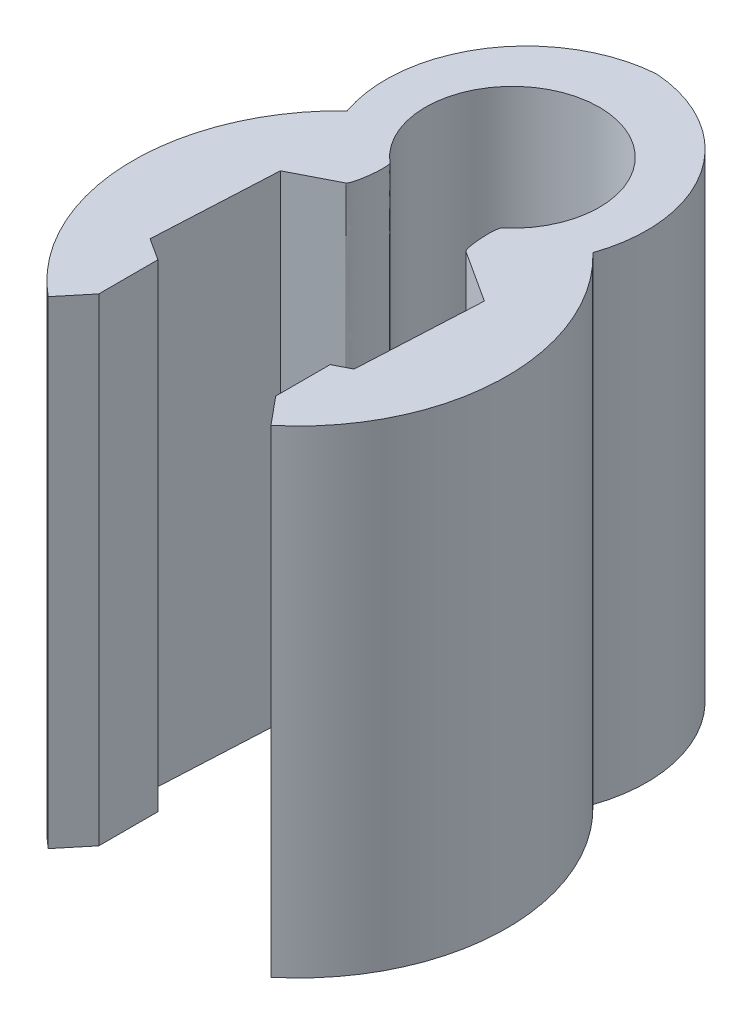
ISO-10303-21;
HEADER;
FILE_DESCRIPTION(('STEP AP214'),'2;1');
FILE_NAME('part.step','',(''),(''),'','','');
FILE_SCHEMA(('AUTOMOTIVE_DESIGN { 1 0 10303 214 1 1 1 1 }'));
ENDSEC;
DATA;
#1=APPLICATION_CONTEXT('core data for automotive mechanical design processes');
#2=APPLICATION_PROTOCOL_DEFINITION('international standard','automotive_design',2000,#1);
#3=PRODUCT_CONTEXT('',#1,'mechanical');
#4=PRODUCT('Part','Part','',(#3));
#5=PRODUCT_RELATED_PRODUCT_CATEGORY('part','',(#4));
#6=PRODUCT_DEFINITION_FORMATION('','',#4);
#7=PRODUCT_DEFINITION_CONTEXT('part definition',#1,'design');
#8=PRODUCT_DEFINITION('design','',#6,#7);
#9=PRODUCT_DEFINITION_SHAPE('','',#8);
#10=(LENGTH_UNIT() NAMED_UNIT(*) SI_UNIT(.MILLI.,.METRE.));
#11=(NAMED_UNIT(*) PLANE_ANGLE_UNIT() SI_UNIT($,.RADIAN.));
#12=(NAMED_UNIT(*) SI_UNIT($,.STERADIAN.) SOLID_ANGLE_UNIT());
#13=UNCERTAINTY_MEASURE_WITH_UNIT(LENGTH_MEASURE(1.E-05),#10,'distance_accuracy_value','');
#14=(GEOMETRIC_REPRESENTATION_CONTEXT(3) GLOBAL_UNCERTAINTY_ASSIGNED_CONTEXT((#13)) GLOBAL_UNIT_ASSIGNED_CONTEXT((#10,
#11,#12)) REPRESENTATION_CONTEXT('',''));
#15=CARTESIAN_POINT('',(0.,0.,0.));
#16=DIRECTION('',(0.,0.,1.));
#17=DIRECTION('',(1.,0.,0.));
#18=AXIS2_PLACEMENT_3D('',#15,#16,#17);
#19=CARTESIAN_POINT('',(-0.598376770378096,25.4,0.494644047014797));
#20=DIRECTION('',(0.770751226655631,0.,-0.637136207265636));
#21=DIRECTION('',(-0.637136207265636,0.,-0.770751226655631));
#22=AXIS2_PLACEMENT_3D('',#19,#20,#21);
#23=PLANE('',#22);
#24=DIRECTION('',(0.637136207265636,0.,0.770751226655631));
#25=VECTOR('',#24,1.);
#26=CARTESIAN_POINT('',(-0.598376770378096,0.,0.494644047014797));
#27=LINE('',#26,#25);
#28=CARTESIAN_POINT('',(4.70120496832042,0.,6.90561093177807));
#29=VERTEX_POINT('',#28);
#30=CARTESIAN_POINT('',(5.9187802535043,0.,8.37852619526394));
#31=VERTEX_POINT('',#30);
#32=EDGE_CURVE('E196',#29,#31,#27,.T.);
#33=ORIENTED_EDGE('',*,*,#32,.T.);
#34=DIRECTION('',(0.,-1.,0.));
#35=VECTOR('',#34,1.);
#36=CARTESIAN_POINT('',(5.9187802535043,25.4,8.37852619526394));
#37=LINE('',#36,#35);
#38=CARTESIAN_POINT('',(5.9187802535043,25.4,8.37852619526394));
#39=VERTEX_POINT('',#38);
#40=EDGE_CURVE('E177',#39,#31,#37,.T.);
#41=ORIENTED_EDGE('',*,*,#40,.F.);
#42=DIRECTION('',(0.637136207265636,0.,0.770751226655631));
#43=VECTOR('',#42,1.);
#44=CARTESIAN_POINT('',(-0.598376770378096,25.4,0.494644047014797));
#45=LINE('',#44,#43);
#46=CARTESIAN_POINT('',(4.70120496832042,25.4,6.90561093177807));
#47=VERTEX_POINT('',#46);
#48=EDGE_CURVE('E183',#47,#39,#45,.T.);
#49=ORIENTED_EDGE('',*,*,#48,.F.);
#50=DIRECTION('',(0.,-1.,0.));
#51=VECTOR('',#50,1.);
#52=CARTESIAN_POINT('',(4.70120496832042,25.4,6.90561093177807));
#53=LINE('',#52,#51);
#54=EDGE_CURVE('E225',#47,#29,#53,.T.);
#55=ORIENTED_EDGE('',*,*,#54,.T.);
#56=EDGE_LOOP('',(#33,#41,#49,#55));
#57=FACE_BOUND('',#56,.T.);
#58=ADVANCED_FACE('F46',(#57),#23,.F.);
#59=CARTESIAN_POINT('',(-1.12456517035275,25.4,-0.141892301269298));
#60=DIRECTION('',(0.,-1.,0.));
#61=DIRECTION('',(0.,0.,-1.));
#62=AXIS2_PLACEMENT_3D('',#59,#60,#61);
#63=CYLINDRICAL_SURFACE('',#62,11.0546933976404);
#64=CARTESIAN_POINT('',(-1.12456517035275,0.,-0.141892301269298));
#65=DIRECTION('',(0.,1.,0.));
#66=DIRECTION('',(0.,0.,1.));
#67=AXIS2_PLACEMENT_3D('',#64,#65,#66);
#68=CIRCLE('',#67,11.0546933976404);
#69=CARTESIAN_POINT('',(6.52662469768185,0.,-8.12096115165017));
#70=VERTEX_POINT('',#69);
#71=EDGE_CURVE('E261',#31,#70,#68,.T.);
#72=ORIENTED_EDGE('',*,*,#71,.T.);
#73=DIRECTION('',(0.,-1.,0.));
#74=VECTOR('',#73,1.);
#75=CARTESIAN_POINT('',(6.52662469768185,25.4,-8.12096115165017));
#76=LINE('',#75,#74);
#77=CARTESIAN_POINT('',(6.52662469768185,25.4,-8.12096115165017));
#78=VERTEX_POINT('',#77);
#79=EDGE_CURVE('E180',#78,#70,#76,.T.);
#80=ORIENTED_EDGE('',*,*,#79,.F.);
#81=CARTESIAN_POINT('',(-1.12456517035275,25.4,-0.141892301269298));
#82=DIRECTION('',(0.,1.,0.));
#83=DIRECTION('',(0.,0.,1.));
#84=AXIS2_PLACEMENT_3D('',#81,#82,#83);
#85=CIRCLE('',#84,11.0546933976404);
#86=EDGE_CURVE('E173',#39,#78,#85,.T.);
#87=ORIENTED_EDGE('',*,*,#86,.F.);
#88=ORIENTED_EDGE('',*,*,#40,.T.);
#89=EDGE_LOOP('',(#72,#80,#87,#88));
#90=FACE_BOUND('',#89,.T.);
#91=ADVANCED_FACE('F175',(#90),#63,.T.);
#92=CARTESIAN_POINT('',(-0.542547571953858,25.4,-10.5725213353697));
#93=DIRECTION('',(0.,-1.,0.));
#94=DIRECTION('',(0.,0.,-1.));
#95=AXIS2_PLACEMENT_3D('',#92,#93,#94);
#96=CYLINDRICAL_SURFACE('',#95,7.48220180910577);
#97=CARTESIAN_POINT('',(-0.542547571953858,0.,-10.5725213353697));
#98=DIRECTION('',(0.,1.,0.));
#99=DIRECTION('',(0.,0.,1.));
#100=AXIS2_PLACEMENT_3D('',#97,#98,#99);
#101=CIRCLE('',#100,7.48220180910577);
#102=CARTESIAN_POINT('',(0.,0.,-18.0350266817231));
#103=VERTEX_POINT('',#102);
#104=EDGE_CURVE('E258',#70,#103,#101,.T.);
#105=ORIENTED_EDGE('',*,*,#104,.T.);
#106=DIRECTION('',(0.,-1.,0.));
#107=VECTOR('',#106,1.);
#108=CARTESIAN_POINT('',(0.,25.4,-18.0350266817231));
#109=LINE('',#108,#107);
#110=CARTESIAN_POINT('',(0.,25.4,-18.0350266817231));
#111=VERTEX_POINT('',#110);
#112=EDGE_CURVE('E201',#111,#103,#109,.T.);
#113=ORIENTED_EDGE('',*,*,#112,.F.);
#114=CARTESIAN_POINT('',(-0.542547571953858,25.4,-10.5725213353697));
#115=DIRECTION('',(0.,1.,0.));
#116=DIRECTION('',(0.,0.,1.));
#117=AXIS2_PLACEMENT_3D('',#114,#115,#116);
#118=CIRCLE('',#117,7.48220180910577);
#119=EDGE_CURVE('E182',#78,#111,#118,.T.);
#120=ORIENTED_EDGE('',*,*,#119,.F.);
#121=ORIENTED_EDGE('',*,*,#79,.T.);
#122=EDGE_LOOP('',(#105,#113,#120,#121));
#123=FACE_BOUND('',#122,.T.);
#124=ADVANCED_FACE('F259',(#123),#96,.T.);
#125=CARTESIAN_POINT('',(0.542547571953858,25.4,-10.5725213353697));
#126=DIRECTION('',(0.,-1.,0.));
#127=DIRECTION('',(0.,0.,-1.));
#128=AXIS2_PLACEMENT_3D('',#125,#126,#127);
#129=CYLINDRICAL_SURFACE('',#128,7.48220180910577);
#130=CARTESIAN_POINT('',(0.542547571953858,0.,-10.5725213353697));
#131=DIRECTION('',(0.,1.,0.));
#132=DIRECTION('',(0.,0.,1.));
#133=AXIS2_PLACEMENT_3D('',#130,#131,#132);
#134=CIRCLE('',#133,7.48220180910577);
#135=CARTESIAN_POINT('',(-6.52662469768186,0.,-8.12096115165017));
#136=VERTEX_POINT('',#135);
#137=EDGE_CURVE('E252',#136,#103,#134,.F.);
#138=ORIENTED_EDGE('',*,*,#137,.F.);
#139=DIRECTION('',(0.,-1.,0.));
#140=VECTOR('',#139,1.);
#141=CARTESIAN_POINT('',(-6.52662469768186,25.4,-8.12096115165017));
#142=LINE('',#141,#140);
#143=CARTESIAN_POINT('',(-6.52662469768186,25.4,-8.12096115165017));
#144=VERTEX_POINT('',#143);
#145=EDGE_CURVE('E244',#144,#136,#142,.T.);
#146=ORIENTED_EDGE('',*,*,#145,.F.);
#147=CARTESIAN_POINT('',(0.542547571953858,25.4,-10.5725213353697));
#148=DIRECTION('',(0.,1.,0.));
#149=DIRECTION('',(0.,0.,1.));
#150=AXIS2_PLACEMENT_3D('',#147,#148,#149);
#151=CIRCLE('',#150,7.48220180910577);
#152=EDGE_CURVE('E255',#144,#111,#151,.F.);
#153=ORIENTED_EDGE('',*,*,#152,.T.);
#154=ORIENTED_EDGE('',*,*,#112,.T.);
#155=EDGE_LOOP('',(#138,#146,#153,#154));
#156=FACE_BOUND('',#155,.T.);
#157=ADVANCED_FACE('F250',(#156),#129,.T.);
#158=CARTESIAN_POINT('',(1.12456517035275,25.4,-0.141892301269298));
#159=DIRECTION('',(0.,-1.,0.));
#160=DIRECTION('',(0.,0.,-1.));
#161=AXIS2_PLACEMENT_3D('',#158,#159,#160);
#162=CYLINDRICAL_SURFACE('',#161,11.0546933976404);
#163=CARTESIAN_POINT('',(1.12456517035275,0.,-0.141892301269298));
#164=DIRECTION('',(0.,1.,0.));
#165=DIRECTION('',(0.,0.,1.));
#166=AXIS2_PLACEMENT_3D('',#163,#164,#165);
#167=CIRCLE('',#166,11.0546933976404);
#168=CARTESIAN_POINT('',(-5.91878025350429,0.,8.37852619526395));
#169=VERTEX_POINT('',#168);
#170=EDGE_CURVE('E266',#169,#136,#167,.F.);
#171=ORIENTED_EDGE('',*,*,#170,.F.);
#172=DIRECTION('',(0.,-1.,0.));
#173=VECTOR('',#172,1.);
#174=CARTESIAN_POINT('',(-5.91878025350429,25.4,8.37852619526395));
#175=LINE('',#174,#173);
#176=CARTESIAN_POINT('',(-5.91878025350429,25.4,8.37852619526395));
#177=VERTEX_POINT('',#176);
#178=EDGE_CURVE('E242',#177,#169,#175,.T.);
#179=ORIENTED_EDGE('',*,*,#178,.F.);
#180=CARTESIAN_POINT('',(1.12456517035275,25.4,-0.141892301269298));
#181=DIRECTION('',(0.,1.,0.));
#182=DIRECTION('',(0.,0.,1.));
#183=AXIS2_PLACEMENT_3D('',#180,#181,#182);
#184=CIRCLE('',#183,11.0546933976404);
#185=EDGE_CURVE('E546',#177,#144,#184,.F.);
#186=ORIENTED_EDGE('',*,*,#185,.T.);
#187=ORIENTED_EDGE('',*,*,#145,.T.);
#188=EDGE_LOOP('',(#171,#179,#186,#187));
#189=FACE_BOUND('',#188,.T.);
#190=ADVANCED_FACE('F507',(#189),#162,.T.);
#191=CARTESIAN_POINT('',(0.598376770378092,25.4,0.494644047014792));
#192=DIRECTION('',(0.770751226655632,0.,0.637136207265635));
#193=DIRECTION('',(0.637136207265635,0.,-0.770751226655632));
#194=AXIS2_PLACEMENT_3D('',#191,#192,#193);
#195=PLANE('',#194);
#196=DIRECTION('',(-0.637136207265635,0.,0.770751226655632));
#197=VECTOR('',#196,1.);
#198=CARTESIAN_POINT('',(0.598376770378092,0.,0.494644047014792));
#199=LINE('',#198,#197);
#200=CARTESIAN_POINT('',(-4.70120496832041,0.,6.90561093177807));
#201=VERTEX_POINT('',#200);
#202=EDGE_CURVE('E268',#201,#169,#199,.T.);
#203=ORIENTED_EDGE('',*,*,#202,.F.);
#204=DIRECTION('',(0.,-1.,0.));
#205=VECTOR('',#204,1.);
#206=CARTESIAN_POINT('',(-4.70120496832041,25.4,6.90561093177807));
#207=LINE('',#206,#205);
#208=CARTESIAN_POINT('',(-4.70120496832041,25.4,6.90561093177807));
#209=VERTEX_POINT('',#208);
#210=EDGE_CURVE('E240',#209,#201,#207,.T.);
#211=ORIENTED_EDGE('',*,*,#210,.F.);
#212=DIRECTION('',(-0.637136207265635,0.,0.770751226655632));
#213=VECTOR('',#212,1.);
#214=CARTESIAN_POINT('',(0.598376770378092,25.4,0.494644047014792));
#215=LINE('',#214,#213);
#216=EDGE_CURVE('E543',#209,#177,#215,.T.);
#217=ORIENTED_EDGE('',*,*,#216,.T.);
#218=ORIENTED_EDGE('',*,*,#178,.T.);
#219=EDGE_LOOP('',(#203,#211,#217,#218));
#220=FACE_BOUND('',#219,.T.);
#221=ADVANCED_FACE('F510',(#220),#195,.T.);
#222=CARTESIAN_POINT('',(-4.70120496832042,25.4,0.));
#223=DIRECTION('',(1.,0.,0.));
#224=DIRECTION('',(0.,0.,-1.));
#225=AXIS2_PLACEMENT_3D('',#222,#223,#224);
#226=PLANE('',#225);
#227=DIRECTION('',(0.,0.,1.));
#228=VECTOR('',#227,1.);
#229=CARTESIAN_POINT('',(-4.70120496832042,0.,0.));
#230=LINE('',#229,#228);
#231=CARTESIAN_POINT('',(-4.70120496832042,0.,3.76579802688678));
#232=VERTEX_POINT('',#231);
#233=EDGE_CURVE('E273',#232,#201,#230,.T.);
#234=ORIENTED_EDGE('',*,*,#233,.F.);
#235=DIRECTION('',(0.,-1.,0.));
#236=VECTOR('',#235,1.);
#237=CARTESIAN_POINT('',(-4.70120496832042,25.4,3.76579802688678));
#238=LINE('',#237,#236);
#239=CARTESIAN_POINT('',(-4.70120496832042,25.4,3.76579802688678));
#240=VERTEX_POINT('',#239);
#241=EDGE_CURVE('E238',#240,#232,#238,.T.);
#242=ORIENTED_EDGE('',*,*,#241,.F.);
#243=DIRECTION('',(0.,0.,1.));
#244=VECTOR('',#243,1.);
#245=CARTESIAN_POINT('',(-4.70120496832042,25.4,0.));
#246=LINE('',#245,#244);
#247=EDGE_CURVE('E538',#240,#209,#246,.T.);
#248=ORIENTED_EDGE('',*,*,#247,.T.);
#249=ORIENTED_EDGE('',*,*,#210,.T.);
#250=EDGE_LOOP('',(#234,#242,#248,#249));
#251=FACE_BOUND('',#250,.T.);
#252=ADVANCED_FACE('F514',(#251),#226,.T.);
#253=CARTESIAN_POINT('',(-3.10319954031292,25.4,4.7991017506406));
#254=DIRECTION('',(0.542992045549067,0.,-0.839737839132214));
#255=DIRECTION('',(-0.839737839132214,0.,-0.542992045549067));
#256=AXIS2_PLACEMENT_3D('',#253,#254,#255);
#257=PLANE('',#256);
#258=DIRECTION('',(0.839737839132214,0.,0.542992045549067));
#259=VECTOR('',#258,1.);
#260=CARTESIAN_POINT('',(-3.10319954031292,0.,4.7991017506406));
#261=LINE('',#260,#259);
#262=CARTESIAN_POINT('',(-5.87396222791367,0.,3.00746866069182));
#263=VERTEX_POINT('',#262);
#264=EDGE_CURVE('E276',#263,#232,#261,.T.);
#265=ORIENTED_EDGE('',*,*,#264,.F.);
#266=DIRECTION('',(0.,-1.,0.));
#267=VECTOR('',#266,1.);
#268=CARTESIAN_POINT('',(-5.87396222791367,25.4,3.00746866069182));
#269=LINE('',#268,#267);
#270=CARTESIAN_POINT('',(-5.87396222791367,25.4,3.00746866069182));
#271=VERTEX_POINT('',#270);
#272=EDGE_CURVE('E236',#271,#263,#269,.T.);
#273=ORIENTED_EDGE('',*,*,#272,.F.);
#274=DIRECTION('',(0.839737839132214,0.,0.542992045549067));
#275=VECTOR('',#274,1.);
#276=CARTESIAN_POINT('',(-3.10319954031292,25.4,4.7991017506406));
#277=LINE('',#276,#275);
#278=EDGE_CURVE('E537',#271,#240,#277,.T.);
#279=ORIENTED_EDGE('',*,*,#278,.T.);
#280=ORIENTED_EDGE('',*,*,#241,.T.);
#281=EDGE_LOOP('',(#265,#273,#279,#280));
#282=FACE_BOUND('',#281,.T.);
#283=ADVANCED_FACE('F518',(#282),#257,.T.);
#284=CARTESIAN_POINT('',(-5.70774380155759,25.4,-0.287898759602873));
#285=DIRECTION('',(0.998730323982081,0.,0.0503759859322613));
#286=DIRECTION('',(0.0503759859322613,0.,-0.998730323982081));
#287=AXIS2_PLACEMENT_3D('',#284,#285,#286);
#288=PLANE('',#287);
#289=DIRECTION('',(-0.0503759859322613,0.,0.998730323982081));
#290=VECTOR('',#289,1.);
#291=CARTESIAN_POINT('',(-5.70774380155759,0.,-0.287898759602873));
#292=LINE('',#291,#290);
#293=CARTESIAN_POINT('',(-5.54152537520151,0.,-3.58326617989757));
#294=VERTEX_POINT('',#293);
#295=EDGE_CURVE('E279',#294,#263,#292,.T.);
#296=ORIENTED_EDGE('',*,*,#295,.F.);
#297=DIRECTION('',(0.,-1.,0.));
#298=VECTOR('',#297,1.);
#299=CARTESIAN_POINT('',(-5.54152537520151,25.4,-3.58326617989757));
#300=LINE('',#299,#298);
#301=CARTESIAN_POINT('',(-5.54152537520151,25.4,-3.58326617989757));
#302=VERTEX_POINT('',#301);
#303=EDGE_CURVE('E233',#302,#294,#300,.T.);
#304=ORIENTED_EDGE('',*,*,#303,.F.);
#305=DIRECTION('',(-0.0503759859322613,0.,0.998730323982081));
#306=VECTOR('',#305,1.);
#307=CARTESIAN_POINT('',(-5.70774380155759,25.4,-0.287898759602873));
#308=LINE('',#307,#306);
#309=EDGE_CURVE('E388',#302,#271,#308,.T.);
#310=ORIENTED_EDGE('',*,*,#309,.T.);
#311=ORIENTED_EDGE('',*,*,#272,.T.);
#312=EDGE_LOOP('',(#296,#304,#310,#311));
#313=FACE_BOUND('',#312,.T.);
#314=ADVANCED_FACE('F521',(#313),#288,.T.);
#315=CARTESIAN_POINT('',(-2.60454426124468,25.4,-5.08700051024348));
#316=DIRECTION('',(0.455738278433015,0.,0.890113825064476));
#317=DIRECTION('',(0.890113825064476,0.,-0.455738278433015));
#318=AXIS2_PLACEMENT_3D('',#315,#316,#317);
#319=PLANE('',#318);
#320=DIRECTION('',(-0.890113825064476,0.,0.455738278433015));
#321=VECTOR('',#320,1.);
#322=CARTESIAN_POINT('',(-2.60454426124468,0.,-5.08700051024348));
#323=LINE('',#322,#321);
#324=CARTESIAN_POINT('',(-3.24270927997033,0.,-4.76026002065594));
#325=VERTEX_POINT('',#324);
#326=EDGE_CURVE('E281',#325,#294,#323,.T.);
#327=ORIENTED_EDGE('',*,*,#326,.F.);
#328=CARTESIAN_POINT('',(-3.24270927997033,26.67,-4.76026002065594));
#329=CARTESIAN_POINT('',(-3.24270927997033,17.3566666666667,-4.76026002065594));
#330=CARTESIAN_POINT('',(-3.24270927997033,8.04333333333334,-4.76026002065594));
#331=CARTESIAN_POINT('',(-3.24270927997033,-1.27,-4.76026002065594));
#332=(BOUNDED_CURVE() B_SPLINE_CURVE(3,(#328,#329,#330,#331),.UNSPECIFIED.,.F.,
.F.) B_SPLINE_CURVE_WITH_KNOTS((4,4),(-0.00127,0.02667),
.UNSPECIFIED.) CURVE() GEOMETRIC_REPRESENTATION_ITEM() RATIONAL_B_SPLINE_CURVE((1.,1.,1.,1.)) REPRESENTATION_ITEM(''));
#333=CARTESIAN_POINT('',(-3.24270927997033,25.4,-4.76026002065594));
#334=VERTEX_POINT('',#333);
#335=EDGE_CURVE('E12',#325,#334,#332,.F.);
#336=ORIENTED_EDGE('',*,*,#335,.T.);
#337=DIRECTION('',(-0.890113825064476,0.,0.455738278433015));
#338=VECTOR('',#337,1.);
#339=CARTESIAN_POINT('',(-2.60454426124468,25.4,-5.08700051024348));
#340=LINE('',#339,#338);
#341=EDGE_CURVE('E319',#334,#302,#340,.T.);
#342=ORIENTED_EDGE('',*,*,#341,.T.);
#343=ORIENTED_EDGE('',*,*,#303,.T.);
#344=EDGE_LOOP('',(#327,#336,#342,#343));
#345=FACE_BOUND('',#344,.T.);
#346=ADVANCED_FACE('F371',(#345),#319,.T.);
#347=CARTESIAN_POINT('',(0.,25.4,-10.3692276538807));
#348=DIRECTION('',(0.,-1.,0.));
#349=DIRECTION('',(0.,0.,-1.));
#350=AXIS2_PLACEMENT_3D('',#347,#348,#349);
#351=CYLINDRICAL_SURFACE('',#350,4.61735997238747);
#352=CARTESIAN_POINT('',(0.,0.,-10.3692276538807));
#353=DIRECTION('',(0.,1.,0.));
#354=DIRECTION('',(0.,0.,1.));
#355=AXIS2_PLACEMENT_3D('',#352,#353,#354);
#356=CIRCLE('',#355,4.61735997238747);
#357=CARTESIAN_POINT('',(2.97420564902517,0.,-6.83735649656018));
#358=VERTEX_POINT('',#357);
#359=CARTESIAN_POINT('',(-2.99713740518316,0.,-6.85679537851113));
#360=VERTEX_POINT('',#359);
#361=EDGE_CURVE('E210',#358,#360,#356,.T.);
#362=ORIENTED_EDGE('',*,*,#361,.F.);
#363=CARTESIAN_POINT('',(2.97420564902517,26.67,-6.83735649656018));
#364=CARTESIAN_POINT('',(2.97420564902517,17.3566666666667,-6.83735649656018));
#365=CARTESIAN_POINT('',(2.97420564902517,8.04333333333334,-6.83735649656018));
#366=CARTESIAN_POINT('',(2.97420564902517,-1.27,-6.83735649656018));
#367=(BOUNDED_CURVE() B_SPLINE_CURVE(3,(#363,#364,#365,#366),.UNSPECIFIED.,.F.,
.F.) B_SPLINE_CURVE_WITH_KNOTS((4,4),(-0.00127,0.02667),
.UNSPECIFIED.) CURVE() GEOMETRIC_REPRESENTATION_ITEM() RATIONAL_B_SPLINE_CURVE((1.,1.,1.,1.)) REPRESENTATION_ITEM(''));
#368=CARTESIAN_POINT('',(2.97420564902517,25.4,-6.83735649656018));
#369=VERTEX_POINT('',#368);
#370=EDGE_CURVE('E455',#358,#369,#367,.F.);
#371=ORIENTED_EDGE('',*,*,#370,.T.);
#372=CARTESIAN_POINT('',(0.,25.4,-10.3692276538807));
#373=DIRECTION('',(0.,1.,0.));
#374=DIRECTION('',(0.,0.,1.));
#375=AXIS2_PLACEMENT_3D('',#372,#373,#374);
#376=CIRCLE('',#375,4.61735997238747);
#377=CARTESIAN_POINT('',(-2.99713740518315,25.4,-6.85679537851113));
#378=VERTEX_POINT('',#377);
#379=EDGE_CURVE('E311',#369,#378,#376,.T.);
#380=ORIENTED_EDGE('',*,*,#379,.T.);
#381=CARTESIAN_POINT('',(-2.99713740518315,-1.27,-6.85679537851113));
#382=CARTESIAN_POINT('',(-2.99713740518315,8.04333333333334,-6.85679537851113));
#383=CARTESIAN_POINT('',(-2.99713740518315,17.3566666666667,-6.85679537851113));
#384=CARTESIAN_POINT('',(-2.99713740518315,26.67,-6.85679537851113));
#385=(BOUNDED_CURVE() B_SPLINE_CURVE(3,(#381,#382,#383,#384),.UNSPECIFIED.,.F.,
.F.) B_SPLINE_CURVE_WITH_KNOTS((4,4),(-0.00127,0.02667),
.UNSPECIFIED.) CURVE() GEOMETRIC_REPRESENTATION_ITEM() RATIONAL_B_SPLINE_CURVE((1.,1.,1.,1.)) REPRESENTATION_ITEM(''));
#386=EDGE_CURVE('E476',#378,#360,#385,.F.);
#387=ORIENTED_EDGE('',*,*,#386,.T.);
#388=EDGE_LOOP('',(#362,#371,#380,#387));
#389=FACE_BOUND('',#388,.T.);
#390=ADVANCED_FACE('F367',(#389),#351,.F.);
#391=CARTESIAN_POINT('',(3.10319954031291,25.4,-4.79910175064061));
#392=DIRECTION('',(-0.542992045549066,0.,0.839737839132214));
#393=DIRECTION('',(0.839737839132214,0.,0.542992045549066));
#394=AXIS2_PLACEMENT_3D('',#391,#392,#393);
#395=PLANE('',#394);
#396=DIRECTION('',(-0.839737839132214,0.,-0.542992045549066));
#397=VECTOR('',#396,1.);
#398=CARTESIAN_POINT('',(3.10319954031291,25.4,-4.79910175064061));
#399=LINE('',#398,#397);
#400=CARTESIAN_POINT('',(5.87396222791367,25.4,-3.00746866069182));
#401=VERTEX_POINT('',#400);
#402=CARTESIAN_POINT('',(3.10265788418253,25.4,-4.79945199682044));
#403=VERTEX_POINT('',#402);
#404=EDGE_CURVE('E211',#401,#403,#399,.T.);
#405=ORIENTED_EDGE('',*,*,#404,.T.);
#406=CARTESIAN_POINT('',(3.10265788418253,-1.27,-4.79945199682044));
#407=CARTESIAN_POINT('',(3.10265788418253,8.04333333333334,-4.79945199682044));
#408=CARTESIAN_POINT('',(3.10265788418253,17.3566666666667,-4.79945199682044));
#409=CARTESIAN_POINT('',(3.10265788418253,26.67,-4.79945199682044));
#410=(BOUNDED_CURVE() B_SPLINE_CURVE(3,(#406,#407,#408,#409),.UNSPECIFIED.,.F.,
.F.) B_SPLINE_CURVE_WITH_KNOTS((4,4),(-0.00127,0.02667),
.UNSPECIFIED.) CURVE() GEOMETRIC_REPRESENTATION_ITEM() RATIONAL_B_SPLINE_CURVE((1.,1.,1.,1.)) REPRESENTATION_ITEM(''));
#411=CARTESIAN_POINT('',(3.10265788418253,0.,-4.79945199682044));
#412=VERTEX_POINT('',#411);
#413=EDGE_CURVE('E197',#403,#412,#410,.F.);
#414=ORIENTED_EDGE('',*,*,#413,.T.);
#415=DIRECTION('',(-0.839737839132214,0.,-0.542992045549066));
#416=VECTOR('',#415,1.);
#417=CARTESIAN_POINT('',(3.10319954031291,0.,-4.79910175064061));
#418=LINE('',#417,#416);
#419=CARTESIAN_POINT('',(5.87396222791367,0.,-3.00746866069182));
#420=VERTEX_POINT('',#419);
#421=EDGE_CURVE('E205',#420,#412,#418,.T.);
#422=ORIENTED_EDGE('',*,*,#421,.F.);
#423=DIRECTION('',(0.,-1.,0.));
#424=VECTOR('',#423,1.);
#425=CARTESIAN_POINT('',(5.87396222791367,25.4,-3.00746866069182));
#426=LINE('',#425,#424);
#427=EDGE_CURVE('E231',#401,#420,#426,.T.);
#428=ORIENTED_EDGE('',*,*,#427,.F.);
#429=EDGE_LOOP('',(#405,#414,#422,#428));
#430=FACE_BOUND('',#429,.T.);
#431=ADVANCED_FACE('F349',(#430),#395,.T.);
#432=CARTESIAN_POINT('',(5.70774380155759,25.4,0.287898759602873));
#433=DIRECTION('',(-0.998730323982081,0.,-0.0503759859322612));
#434=DIRECTION('',(-0.0503759859322612,0.,0.998730323982081));
#435=AXIS2_PLACEMENT_3D('',#432,#433,#434);
#436=PLANE('',#435);
#437=DIRECTION('',(0.0503759859322612,0.,-0.998730323982081));
#438=VECTOR('',#437,1.);
#439=CARTESIAN_POINT('',(5.70774380155759,0.,0.287898759602873));
#440=LINE('',#439,#438);
#441=CARTESIAN_POINT('',(5.54152537520151,0.,3.58326617989757));
#442=VERTEX_POINT('',#441);
#443=EDGE_CURVE('E209',#442,#420,#440,.T.);
#444=ORIENTED_EDGE('',*,*,#443,.F.);
#445=DIRECTION('',(0.,-1.,0.));
#446=VECTOR('',#445,1.);
#447=CARTESIAN_POINT('',(5.54152537520151,25.4,3.58326617989757));
#448=LINE('',#447,#446);
#449=CARTESIAN_POINT('',(5.54152537520151,25.4,3.58326617989757));
#450=VERTEX_POINT('',#449);
#451=EDGE_CURVE('E229',#450,#442,#448,.T.);
#452=ORIENTED_EDGE('',*,*,#451,.F.);
#453=DIRECTION('',(0.0503759859322612,0.,-0.998730323982081));
#454=VECTOR('',#453,1.);
#455=CARTESIAN_POINT('',(5.70774380155759,25.4,0.287898759602873));
#456=LINE('',#455,#454);
#457=EDGE_CURVE('E328',#450,#401,#456,.T.);
#458=ORIENTED_EDGE('',*,*,#457,.T.);
#459=ORIENTED_EDGE('',*,*,#427,.T.);
#460=EDGE_LOOP('',(#444,#452,#458,#459));
#461=FACE_BOUND('',#460,.T.);
#462=ADVANCED_FACE('F343',(#461),#436,.T.);
#463=CARTESIAN_POINT('',(2.60454426124468,25.4,5.08700051024348));
#464=DIRECTION('',(-0.455738278433015,0.,-0.890113825064475));
#465=DIRECTION('',(-0.890113825064476,0.,0.455738278433015));
#466=AXIS2_PLACEMENT_3D('',#463,#464,#465);
#467=PLANE('',#466);
#468=DIRECTION('',(0.890113825064476,0.,-0.455738278433015));
#469=VECTOR('',#468,1.);
#470=CARTESIAN_POINT('',(2.60454426124468,0.,5.08700051024348));
#471=LINE('',#470,#469);
#472=CARTESIAN_POINT('',(4.70120496832042,0.,4.01351022822069));
#473=VERTEX_POINT('',#472);
#474=EDGE_CURVE('E221',#473,#442,#471,.T.);
#475=ORIENTED_EDGE('',*,*,#474,.F.);
#476=DIRECTION('',(0.,-1.,0.));
#477=VECTOR('',#476,1.);
#478=CARTESIAN_POINT('',(4.70120496832042,25.4,4.01351022822069));
#479=LINE('',#478,#477);
#480=CARTESIAN_POINT('',(4.70120496832042,25.4,4.01351022822069));
#481=VERTEX_POINT('',#480);
#482=EDGE_CURVE('E227',#481,#473,#479,.T.);
#483=ORIENTED_EDGE('',*,*,#482,.F.);
#484=DIRECTION('',(0.890113825064476,0.,-0.455738278433015));
#485=VECTOR('',#484,1.);
#486=CARTESIAN_POINT('',(2.60454426124468,25.4,5.08700051024348));
#487=LINE('',#486,#485);
#488=EDGE_CURVE('E331',#481,#450,#487,.T.);
#489=ORIENTED_EDGE('',*,*,#488,.T.);
#490=ORIENTED_EDGE('',*,*,#451,.T.);
#491=EDGE_LOOP('',(#475,#483,#489,#490));
#492=FACE_BOUND('',#491,.T.);
#493=ADVANCED_FACE('F339',(#492),#467,.T.);
#494=CARTESIAN_POINT('',(4.70120496832042,25.4,0.));
#495=DIRECTION('',(1.,0.,0.));
#496=DIRECTION('',(0.,0.,-1.));
#497=AXIS2_PLACEMENT_3D('',#494,#495,#496);
#498=PLANE('',#497);
#499=DIRECTION('',(0.,0.,1.));
#500=VECTOR('',#499,1.);
#501=CARTESIAN_POINT('',(4.70120496832042,0.,0.));
#502=LINE('',#501,#500);
#503=EDGE_CURVE('E193',#473,#29,#502,.T.);
#504=ORIENTED_EDGE('',*,*,#503,.T.);
#505=ORIENTED_EDGE('',*,*,#54,.F.);
#506=DIRECTION('',(0.,0.,1.));
#507=VECTOR('',#506,1.);
#508=CARTESIAN_POINT('',(4.70120496832042,25.4,0.));
#509=LINE('',#508,#507);
#510=EDGE_CURVE('E189',#481,#47,#509,.T.);
#511=ORIENTED_EDGE('',*,*,#510,.F.);
#512=ORIENTED_EDGE('',*,*,#482,.T.);
#513=EDGE_LOOP('',(#504,#505,#511,#512));
#514=FACE_BOUND('',#513,.T.);
#515=ADVANCED_FACE('F305',(#514),#498,.F.);
#516=CARTESIAN_POINT('',(0.,25.4,0.));
#517=DIRECTION('',(0.,1.,0.));
#518=DIRECTION('',(0.,0.,1.));
#519=AXIS2_PLACEMENT_3D('',#516,#517,#518);
#520=PLANE('',#519);
#521=ORIENTED_EDGE('',*,*,#379,.F.);
#522=CARTESIAN_POINT('',(3.10265788418253,25.4,-4.79945199682044));
#523=CARTESIAN_POINT('',(1.66110640734555,25.4,-5.73158932432362));
#524=CARTESIAN_POINT('',(2.97420564902517,25.4,-6.83735649656018));
#525=(BOUNDED_CURVE() B_SPLINE_CURVE(2,(#522,#523,#524),.UNSPECIFIED.,.F.,
.F.) B_SPLINE_CURVE_WITH_KNOTS((3,3),(0.,1.),
.UNSPECIFIED.) CURVE() GEOMETRIC_REPRESENTATION_ITEM() RATIONAL_B_SPLINE_CURVE((1.,
0.118948345896042,1.)) REPRESENTATION_ITEM(''));
#526=EDGE_CURVE('E60',#369,#403,#525,.F.);
#527=ORIENTED_EDGE('',*,*,#526,.T.);
#528=ORIENTED_EDGE('',*,*,#404,.F.);
#529=ORIENTED_EDGE('',*,*,#457,.F.);
#530=ORIENTED_EDGE('',*,*,#488,.F.);
#531=ORIENTED_EDGE('',*,*,#510,.T.);
#532=ORIENTED_EDGE('',*,*,#48,.T.);
#533=ORIENTED_EDGE('',*,*,#86,.T.);
#534=ORIENTED_EDGE('',*,*,#119,.T.);
#535=ORIENTED_EDGE('',*,*,#152,.F.);
#536=ORIENTED_EDGE('',*,*,#185,.F.);
#537=ORIENTED_EDGE('',*,*,#216,.F.);
#538=ORIENTED_EDGE('',*,*,#247,.F.);
#539=ORIENTED_EDGE('',*,*,#278,.F.);
#540=ORIENTED_EDGE('',*,*,#309,.F.);
#541=ORIENTED_EDGE('',*,*,#341,.F.);
#542=CARTESIAN_POINT('',(-2.99713740518315,25.4,-6.85679537851113));
#543=CARTESIAN_POINT('',(-1.55363692098566,25.4,-5.6250650684561));
#544=CARTESIAN_POINT('',(-3.24270927997033,25.4,-4.76026002065594));
#545=(BOUNDED_CURVE() B_SPLINE_CURVE(2,(#542,#543,#544),.UNSPECIFIED.,.F.,
.F.) B_SPLINE_CURVE_WITH_KNOTS((3,3),(0.,1.),
.UNSPECIFIED.) CURVE() GEOMETRIC_REPRESENTATION_ITEM() RATIONAL_B_SPLINE_CURVE((1.,
0.111239360045646,1.)) REPRESENTATION_ITEM(''));
#546=EDGE_CURVE('E73',#334,#378,#545,.F.);
#547=ORIENTED_EDGE('',*,*,#546,.T.);
#548=EDGE_LOOP('',(#521,#527,#528,#529,#530,#531,#532,#533,#534,#535,#536,#537,#538,#539,#540,
#541,#547));
#549=FACE_BOUND('',#548,.T.);
#550=ADVANCED_FACE('F186',(#549),#520,.T.);
#551=CARTESIAN_POINT('',(0.,0.,0.));
#552=DIRECTION('',(0.,1.,0.));
#553=DIRECTION('',(0.,0.,1.));
#554=AXIS2_PLACEMENT_3D('',#551,#552,#553);
#555=PLANE('',#554);
#556=ORIENTED_EDGE('',*,*,#421,.T.);
#557=CARTESIAN_POINT('',(2.97420564902517,0.,-6.83735649656018));
#558=CARTESIAN_POINT('',(1.66110640734555,0.,-5.73158932432362));
#559=CARTESIAN_POINT('',(3.10265788418253,0.,-4.79945199682044));
#560=(BOUNDED_CURVE() B_SPLINE_CURVE(2,(#557,#558,#559),.UNSPECIFIED.,.F.,
.F.) B_SPLINE_CURVE_WITH_KNOTS((3,3),(0.,1.),
.UNSPECIFIED.) CURVE() GEOMETRIC_REPRESENTATION_ITEM() RATIONAL_B_SPLINE_CURVE((1.,
0.118948345896042,1.)) REPRESENTATION_ITEM(''));
#561=EDGE_CURVE('E345',#412,#358,#560,.F.);
#562=ORIENTED_EDGE('',*,*,#561,.T.);
#563=ORIENTED_EDGE('',*,*,#361,.T.);
#564=CARTESIAN_POINT('',(-3.24270927997033,0.,-4.76026002065594));
#565=CARTESIAN_POINT('',(-1.55363692098566,0.,-5.6250650684561));
#566=CARTESIAN_POINT('',(-2.99713740518315,0.,-6.85679537851113));
#567=(BOUNDED_CURVE() B_SPLINE_CURVE(2,(#564,#565,#566),.UNSPECIFIED.,.F.,
.F.) B_SPLINE_CURVE_WITH_KNOTS((3,3),(0.,1.),
.UNSPECIFIED.) CURVE() GEOMETRIC_REPRESENTATION_ITEM() RATIONAL_B_SPLINE_CURVE((1.,
0.111239360045646,1.)) REPRESENTATION_ITEM(''));
#568=EDGE_CURVE('E200',#360,#325,#567,.F.);
#569=ORIENTED_EDGE('',*,*,#568,.T.);
#570=ORIENTED_EDGE('',*,*,#326,.T.);
#571=ORIENTED_EDGE('',*,*,#295,.T.);
#572=ORIENTED_EDGE('',*,*,#264,.T.);
#573=ORIENTED_EDGE('',*,*,#233,.T.);
#574=ORIENTED_EDGE('',*,*,#202,.T.);
#575=ORIENTED_EDGE('',*,*,#170,.T.);
#576=ORIENTED_EDGE('',*,*,#137,.T.);
#577=ORIENTED_EDGE('',*,*,#104,.F.);
#578=ORIENTED_EDGE('',*,*,#71,.F.);
#579=ORIENTED_EDGE('',*,*,#32,.F.);
#580=ORIENTED_EDGE('',*,*,#503,.F.);
#581=ORIENTED_EDGE('',*,*,#474,.T.);
#582=ORIENTED_EDGE('',*,*,#443,.T.);
#583=EDGE_LOOP('',(#556,#562,#563,#569,#570,#571,#572,#573,#574,#575,#576,#577,#578,#579,#580,
#581,#582));
#584=FACE_BOUND('',#583,.T.);
#585=ADVANCED_FACE('F263',(#584),#555,.F.);
#586=CARTESIAN_POINT('',(3.10265788418253,26.67,-4.79945199682044));
#587=CARTESIAN_POINT('',(3.10265788418253,17.3566666666667,-4.79945199682044));
#588=CARTESIAN_POINT('',(3.10265788418253,8.04333333333334,-4.79945199682044));
#589=CARTESIAN_POINT('',(3.10265788418253,-1.27,-4.79945199682044));
#590=CARTESIAN_POINT('',(1.66110640734555,26.67,-5.73158932432362));
#591=CARTESIAN_POINT('',(1.66110640734555,17.3566666666667,-5.73158932432362));
#592=CARTESIAN_POINT('',(1.66110640734555,8.04333333333334,-5.73158932432362));
#593=CARTESIAN_POINT('',(1.66110640734555,-1.27,-5.73158932432362));
#594=CARTESIAN_POINT('',(2.97420564902517,26.67,-6.83735649656018));
#595=CARTESIAN_POINT('',(2.97420564902517,17.3566666666667,-6.83735649656018));
#596=CARTESIAN_POINT('',(2.97420564902517,8.04333333333334,-6.83735649656018));
#597=CARTESIAN_POINT('',(2.97420564902517,-1.27,-6.83735649656018));
#598=(BOUNDED_SURFACE() B_SPLINE_SURFACE(2,3,((#586,#587,#588,#589),(#590,#591,#592,#593),(#594,
#595,#596,#597)),.UNSPECIFIED.,.F.,.F.,.F.) B_SPLINE_SURFACE_WITH_KNOTS((3,3),(4,4),(0.,1.),
(-0.00127,0.02667),
.UNSPECIFIED.) GEOMETRIC_REPRESENTATION_ITEM() RATIONAL_B_SPLINE_SURFACE(((1.,1.,1.,1.),
(0.118948345896042,0.118948345896042,0.118948345896042,0.118948345896042),(1.,1.,1.,1.))) REPRESENTATION_ITEM('') SURFACE());
#599=ORIENTED_EDGE('',*,*,#526,.F.);
#600=ORIENTED_EDGE('',*,*,#370,.F.);
#601=ORIENTED_EDGE('',*,*,#561,.F.);
#602=ORIENTED_EDGE('',*,*,#413,.F.);
#603=EDGE_LOOP('',(#599,#600,#601,#602));
#604=FACE_BOUND('',#603,.T.);
#605=ADVANCED_FACE('F303',(#604),#598,.T.);
#606=CARTESIAN_POINT('',(-2.99713740518315,26.67,-6.85679537851113));
#607=CARTESIAN_POINT('',(-2.99713740518315,17.3566666666667,-6.85679537851113));
#608=CARTESIAN_POINT('',(-2.99713740518315,8.04333333333334,-6.85679537851113));
#609=CARTESIAN_POINT('',(-2.99713740518315,-1.27,-6.85679537851113));
#610=CARTESIAN_POINT('',(-1.55363692098566,26.67,-5.6250650684561));
#611=CARTESIAN_POINT('',(-1.55363692098566,17.3566666666667,-5.6250650684561));
#612=CARTESIAN_POINT('',(-1.55363692098566,8.04333333333335,-5.6250650684561));
#613=CARTESIAN_POINT('',(-1.55363692098566,-1.27,-5.6250650684561));
#614=CARTESIAN_POINT('',(-3.24270927997033,26.67,-4.76026002065594));
#615=CARTESIAN_POINT('',(-3.24270927997033,17.3566666666667,-4.76026002065594));
#616=CARTESIAN_POINT('',(-3.24270927997033,8.04333333333334,-4.76026002065594));
#617=CARTESIAN_POINT('',(-3.24270927997033,-1.27,-4.76026002065594));
#618=(BOUNDED_SURFACE() B_SPLINE_SURFACE(2,3,((#606,#607,#608,#609),(#610,#611,#612,#613),(#614,
#615,#616,#617)),.UNSPECIFIED.,.F.,.F.,.F.) B_SPLINE_SURFACE_WITH_KNOTS((3,3),(4,4),(0.,1.),
(-0.00127,0.02667),
.UNSPECIFIED.) GEOMETRIC_REPRESENTATION_ITEM() RATIONAL_B_SPLINE_SURFACE(((1.,1.,1.,1.),
(0.111239360045646,0.111239360045646,0.111239360045646,0.111239360045646),(1.,1.,1.,1.))) REPRESENTATION_ITEM('') SURFACE());
#619=ORIENTED_EDGE('',*,*,#546,.F.);
#620=ORIENTED_EDGE('',*,*,#335,.F.);
#621=ORIENTED_EDGE('',*,*,#568,.F.);
#622=ORIENTED_EDGE('',*,*,#386,.F.);
#623=EDGE_LOOP('',(#619,#620,#621,#622));
#624=FACE_BOUND('',#623,.T.);
#625=ADVANCED_FACE('F49',(#624),#618,.T.);
#626=CLOSED_SHELL('',(#58,#91,#124,#157,#190,#221,#252,#283,#314,#346,#390,#431,#462,#493,#515,
#550,#585,#605,#625));
#627=MANIFOLD_SOLID_BREP('B2',#626);
#628=ADVANCED_BREP_SHAPE_REPRESENTATION('',(#18,#627),#14);
#629=SHAPE_DEFINITION_REPRESENTATION(#9,#628);
ENDSEC;
END-ISO-10303-21;
